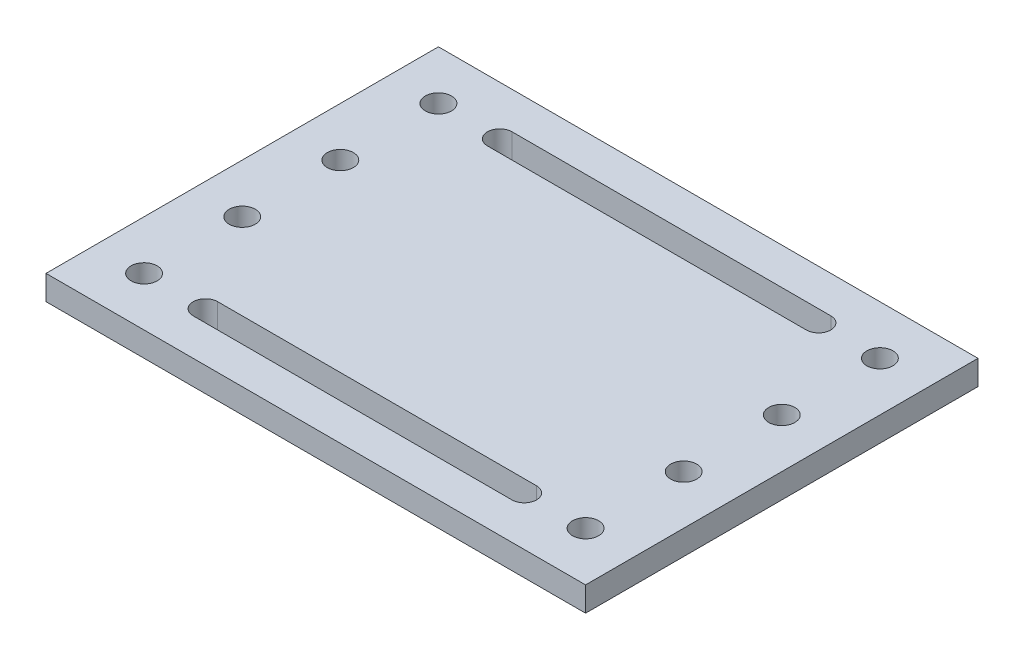
ISO-10303-21;
HEADER;
FILE_DESCRIPTION(('STEP AP214'),'2;1');
FILE_NAME('part.step','',(''),(''),'','','');
FILE_SCHEMA(('AUTOMOTIVE_DESIGN { 1 0 10303 214 1 1 1 1 }'));
ENDSEC;
DATA;
#1=APPLICATION_CONTEXT('core data for automotive mechanical design processes');
#2=APPLICATION_PROTOCOL_DEFINITION('international standard','automotive_design',2000,#1);
#3=PRODUCT_CONTEXT('',#1,'mechanical');
#4=PRODUCT('Part','Part','',(#3));
#5=PRODUCT_RELATED_PRODUCT_CATEGORY('part','',(#4));
#6=PRODUCT_DEFINITION_FORMATION('','',#4);
#7=PRODUCT_DEFINITION_CONTEXT('part definition',#1,'design');
#8=PRODUCT_DEFINITION('design','',#6,#7);
#9=PRODUCT_DEFINITION_SHAPE('','',#8);
#10=(LENGTH_UNIT() NAMED_UNIT(*) SI_UNIT(.MILLI.,.METRE.));
#11=(NAMED_UNIT(*) PLANE_ANGLE_UNIT() SI_UNIT($,.RADIAN.));
#12=(NAMED_UNIT(*) SI_UNIT($,.STERADIAN.) SOLID_ANGLE_UNIT());
#13=UNCERTAINTY_MEASURE_WITH_UNIT(LENGTH_MEASURE(1.E-05),#10,'distance_accuracy_value','');
#14=(GEOMETRIC_REPRESENTATION_CONTEXT(3) GLOBAL_UNCERTAINTY_ASSIGNED_CONTEXT((#13)) GLOBAL_UNIT_ASSIGNED_CONTEXT((#10,
#11,#12)) REPRESENTATION_CONTEXT('',''));
#15=CARTESIAN_POINT('',(0.,0.,0.));
#16=DIRECTION('',(0.,0.,1.));
#17=DIRECTION('',(1.,0.,0.));
#18=AXIS2_PLACEMENT_3D('',#15,#16,#17);
#19=CARTESIAN_POINT('',(0.,0.,0.));
#20=DIRECTION('',(0.,-1.,0.));
#21=DIRECTION('',(0.,0.,-1.));
#22=AXIS2_PLACEMENT_3D('',#19,#20,#21);
#23=PLANE('',#22);
#24=CARTESIAN_POINT('',(215.9,0.,-12.7));
#25=DIRECTION('',(0.,1.,0.));
#26=DIRECTION('',(0.,0.,1.));
#27=AXIS2_PLACEMENT_3D('',#24,#25,#26);
#28=CIRCLE('',#27,3.3782);
#29=CARTESIAN_POINT('',(215.9,0.,-9.3218));
#30=VERTEX_POINT('',#29);
#31=EDGE_CURVE('E240',#30,#30,#28,.T.);
#32=ORIENTED_EDGE('',*,*,#31,.T.);
#33=EDGE_LOOP('',(#32));
#34=FACE_BOUND('',#33,.T.);
#35=CARTESIAN_POINT('',(215.9,0.,-38.1));
#36=DIRECTION('',(0.,1.,0.));
#37=DIRECTION('',(0.,0.,1.));
#38=AXIS2_PLACEMENT_3D('',#35,#36,#37);
#39=CIRCLE('',#38,3.3782);
#40=CARTESIAN_POINT('',(215.9,0.,-34.7218));
#41=VERTEX_POINT('',#40);
#42=EDGE_CURVE('E234',#41,#41,#39,.T.);
#43=ORIENTED_EDGE('',*,*,#42,.T.);
#44=EDGE_LOOP('',(#43));
#45=FACE_BOUND('',#44,.T.);
#46=CARTESIAN_POINT('',(215.9,0.,12.7));
#47=DIRECTION('',(0.,1.,0.));
#48=DIRECTION('',(0.,0.,1.));
#49=AXIS2_PLACEMENT_3D('',#46,#47,#48);
#50=CIRCLE('',#49,3.3782);
#51=CARTESIAN_POINT('',(215.9,0.,16.0782));
#52=VERTEX_POINT('',#51);
#53=EDGE_CURVE('E228',#52,#52,#50,.T.);
#54=ORIENTED_EDGE('',*,*,#53,.T.);
#55=EDGE_LOOP('',(#54));
#56=FACE_BOUND('',#55,.T.);
#57=CARTESIAN_POINT('',(215.9,0.,38.1));
#58=DIRECTION('',(0.,1.,0.));
#59=DIRECTION('',(0.,0.,1.));
#60=AXIS2_PLACEMENT_3D('',#57,#58,#59);
#61=CIRCLE('',#60,3.3782);
#62=CARTESIAN_POINT('',(215.9,0.,41.4782));
#63=VERTEX_POINT('',#62);
#64=EDGE_CURVE('E215',#63,#63,#61,.T.);
#65=ORIENTED_EDGE('',*,*,#64,.T.);
#66=EDGE_LOOP('',(#65));
#67=FACE_BOUND('',#66,.T.);
#68=DIRECTION('',(-1.,0.,0.));
#69=VECTOR('',#68,1.);
#70=CARTESIAN_POINT('',(200.025,0.,-34.925));
#71=LINE('',#70,#69);
#72=CARTESIAN_POINT('',(200.025,0.,-34.925));
#73=VERTEX_POINT('',#72);
#74=CARTESIAN_POINT('',(117.475,0.,-34.925));
#75=VERTEX_POINT('',#74);
#76=EDGE_CURVE('E199',#73,#75,#71,.T.);
#77=ORIENTED_EDGE('',*,*,#76,.F.);
#78=CARTESIAN_POINT('',(200.025,0.,-38.1));
#79=DIRECTION('',(0.,-1.,0.));
#80=DIRECTION('',(0.,0.,-1.));
#81=AXIS2_PLACEMENT_3D('',#78,#79,#80);
#82=CIRCLE('',#81,3.175);
#83=CARTESIAN_POINT('',(200.025,0.,-41.275));
#84=VERTEX_POINT('',#83);
#85=EDGE_CURVE('E207',#84,#73,#82,.T.);
#86=ORIENTED_EDGE('',*,*,#85,.F.);
#87=DIRECTION('',(1.,0.,0.));
#88=VECTOR('',#87,1.);
#89=CARTESIAN_POINT('',(200.025,0.,-41.275));
#90=LINE('',#89,#88);
#91=CARTESIAN_POINT('',(117.475,0.,-41.275));
#92=VERTEX_POINT('',#91);
#93=EDGE_CURVE('E220',#92,#84,#90,.T.);
#94=ORIENTED_EDGE('',*,*,#93,.F.);
#95=CARTESIAN_POINT('',(117.475,0.,-38.1));
#96=DIRECTION('',(0.,-1.,0.));
#97=DIRECTION('',(0.,0.,-1.));
#98=AXIS2_PLACEMENT_3D('',#95,#96,#97);
#99=CIRCLE('',#98,3.175);
#100=EDGE_CURVE('E217',#75,#92,#99,.T.);
#101=ORIENTED_EDGE('',*,*,#100,.F.);
#102=EDGE_LOOP('',(#77,#86,#94,#101));
#103=FACE_BOUND('',#102,.T.);
#104=CARTESIAN_POINT('',(200.025,0.,38.1));
#105=DIRECTION('',(0.,1.,0.));
#106=DIRECTION('',(0.,0.,1.));
#107=AXIS2_PLACEMENT_3D('',#104,#105,#106);
#108=CIRCLE('',#107,3.175);
#109=CARTESIAN_POINT('',(200.025,0.,41.275));
#110=VERTEX_POINT('',#109);
#111=CARTESIAN_POINT('',(200.025,0.,34.925));
#112=VERTEX_POINT('',#111);
#113=EDGE_CURVE('E176',#110,#112,#108,.T.);
#114=ORIENTED_EDGE('',*,*,#113,.T.);
#115=DIRECTION('',(-1.,0.,0.));
#116=VECTOR('',#115,1.);
#117=CARTESIAN_POINT('',(200.025,0.,34.925));
#118=LINE('',#117,#116);
#119=CARTESIAN_POINT('',(117.475,0.,34.925));
#120=VERTEX_POINT('',#119);
#121=EDGE_CURVE('E191',#112,#120,#118,.T.);
#122=ORIENTED_EDGE('',*,*,#121,.T.);
#123=CARTESIAN_POINT('',(117.475,0.,38.1));
#124=DIRECTION('',(0.,1.,0.));
#125=DIRECTION('',(0.,0.,1.));
#126=AXIS2_PLACEMENT_3D('',#123,#124,#125);
#127=CIRCLE('',#126,3.175);
#128=CARTESIAN_POINT('',(117.475,0.,41.275));
#129=VERTEX_POINT('',#128);
#130=EDGE_CURVE('E188',#120,#129,#127,.T.);
#131=ORIENTED_EDGE('',*,*,#130,.T.);
#132=DIRECTION('',(1.,0.,0.));
#133=VECTOR('',#132,1.);
#134=CARTESIAN_POINT('',(200.025,0.,41.275));
#135=LINE('',#134,#133);
#136=EDGE_CURVE('E168',#129,#110,#135,.T.);
#137=ORIENTED_EDGE('',*,*,#136,.T.);
#138=EDGE_LOOP('',(#114,#122,#131,#137));
#139=FACE_BOUND('',#138,.T.);
#140=DIRECTION('',(0.,0.,-1.));
#141=VECTOR('',#140,1.);
#142=CARTESIAN_POINT('',(88.8999999999999,0.,50.8));
#143=LINE('',#142,#141);
#144=CARTESIAN_POINT('',(88.9,0.,50.8));
#145=VERTEX_POINT('',#144);
#146=CARTESIAN_POINT('',(88.8999999999999,0.,-50.8));
#147=VERTEX_POINT('',#146);
#148=EDGE_CURVE('E51',#145,#147,#143,.T.);
#149=ORIENTED_EDGE('',*,*,#148,.T.);
#150=DIRECTION('',(-1.,0.,0.));
#151=VECTOR('',#150,1.);
#152=CARTESIAN_POINT('',(-228.6,0.,-50.8));
#153=LINE('',#152,#151);
#154=CARTESIAN_POINT('',(228.6,0.,-50.8));
#155=VERTEX_POINT('',#154);
#156=EDGE_CURVE('E139',#155,#147,#153,.T.);
#157=ORIENTED_EDGE('',*,*,#156,.F.);
#158=DIRECTION('',(0.,0.,-1.));
#159=VECTOR('',#158,1.);
#160=CARTESIAN_POINT('',(228.6,0.,50.8));
#161=LINE('',#160,#159);
#162=CARTESIAN_POINT('',(228.6,0.,50.8));
#163=VERTEX_POINT('',#162);
#164=EDGE_CURVE('E145',#163,#155,#161,.T.);
#165=ORIENTED_EDGE('',*,*,#164,.F.);
#166=DIRECTION('',(1.,0.,0.));
#167=VECTOR('',#166,1.);
#168=CARTESIAN_POINT('',(-228.6,0.,50.8));
#169=LINE('',#168,#167);
#170=EDGE_CURVE('E140',#145,#163,#169,.T.);
#171=ORIENTED_EDGE('',*,*,#170,.F.);
#172=EDGE_LOOP('',(#149,#157,#165,#171));
#173=FACE_BOUND('',#172,.T.);
#174=CARTESIAN_POINT('',(101.6,0.,-12.7));
#175=DIRECTION('',(0.,1.,0.));
#176=DIRECTION('',(0.,0.,1.));
#177=AXIS2_PLACEMENT_3D('',#174,#175,#176);
#178=CIRCLE('',#177,3.3782);
#179=CARTESIAN_POINT('',(101.6,0.,-9.3218));
#180=VERTEX_POINT('',#179);
#181=EDGE_CURVE('E246',#180,#180,#178,.T.);
#182=ORIENTED_EDGE('',*,*,#181,.T.);
#183=EDGE_LOOP('',(#182));
#184=FACE_BOUND('',#183,.T.);
#185=CARTESIAN_POINT('',(101.6,0.,-38.1));
#186=DIRECTION('',(0.,1.,0.));
#187=DIRECTION('',(0.,0.,1.));
#188=AXIS2_PLACEMENT_3D('',#185,#186,#187);
#189=CIRCLE('',#188,3.3782);
#190=CARTESIAN_POINT('',(101.6,0.,-34.7218));
#191=VERTEX_POINT('',#190);
#192=EDGE_CURVE('E253',#191,#191,#189,.T.);
#193=ORIENTED_EDGE('',*,*,#192,.T.);
#194=EDGE_LOOP('',(#193));
#195=FACE_BOUND('',#194,.T.);
#196=CARTESIAN_POINT('',(101.6,0.,12.7));
#197=DIRECTION('',(0.,1.,0.));
#198=DIRECTION('',(0.,0.,1.));
#199=AXIS2_PLACEMENT_3D('',#196,#197,#198);
#200=CIRCLE('',#199,3.3782);
#201=CARTESIAN_POINT('',(101.6,0.,16.0782));
#202=VERTEX_POINT('',#201);
#203=EDGE_CURVE('E259',#202,#202,#200,.T.);
#204=ORIENTED_EDGE('',*,*,#203,.T.);
#205=EDGE_LOOP('',(#204));
#206=FACE_BOUND('',#205,.T.);
#207=CARTESIAN_POINT('',(101.6,0.,38.1));
#208=DIRECTION('',(0.,1.,0.));
#209=DIRECTION('',(0.,0.,1.));
#210=AXIS2_PLACEMENT_3D('',#207,#208,#209);
#211=CIRCLE('',#210,3.3782);
#212=CARTESIAN_POINT('',(101.6,0.,41.4782));
#213=VERTEX_POINT('',#212);
#214=EDGE_CURVE('E265',#213,#213,#211,.T.);
#215=ORIENTED_EDGE('',*,*,#214,.T.);
#216=EDGE_LOOP('',(#215));
#217=FACE_BOUND('',#216,.T.);
#218=ADVANCED_FACE('F36',(#34,#45,#56,#67,#103,#139,#173,#184,#195,#206,#217),#23,.T.);
#219=CARTESIAN_POINT('',(0.,6.35,0.));
#220=DIRECTION('',(0.,-1.,0.));
#221=DIRECTION('',(0.,0.,-1.));
#222=AXIS2_PLACEMENT_3D('',#219,#220,#221);
#223=PLANE('',#222);
#224=CARTESIAN_POINT('',(101.6,6.35,38.1));
#225=DIRECTION('',(0.,1.,0.));
#226=DIRECTION('',(0.,0.,1.));
#227=AXIS2_PLACEMENT_3D('',#224,#225,#226);
#228=CIRCLE('',#227,3.37819999999998);
#229=CARTESIAN_POINT('',(101.6,6.35,41.4782));
#230=VERTEX_POINT('',#229);
#231=EDGE_CURVE('E268',#230,#230,#228,.T.);
#232=ORIENTED_EDGE('',*,*,#231,.F.);
#233=EDGE_LOOP('',(#232));
#234=FACE_BOUND('',#233,.T.);
#235=CARTESIAN_POINT('',(101.6,6.35,12.7));
#236=DIRECTION('',(0.,1.,0.));
#237=DIRECTION('',(0.,0.,1.));
#238=AXIS2_PLACEMENT_3D('',#235,#236,#237);
#239=CIRCLE('',#238,3.37819999999998);
#240=CARTESIAN_POINT('',(101.6,6.35,16.0782));
#241=VERTEX_POINT('',#240);
#242=EDGE_CURVE('E262',#241,#241,#239,.T.);
#243=ORIENTED_EDGE('',*,*,#242,.F.);
#244=EDGE_LOOP('',(#243));
#245=FACE_BOUND('',#244,.T.);
#246=CARTESIAN_POINT('',(101.6,6.35,-12.7));
#247=DIRECTION('',(0.,1.,0.));
#248=DIRECTION('',(0.,0.,1.));
#249=AXIS2_PLACEMENT_3D('',#246,#247,#248);
#250=CIRCLE('',#249,3.37819999999998);
#251=CARTESIAN_POINT('',(101.6,6.35,-9.32180000000001));
#252=VERTEX_POINT('',#251);
#253=EDGE_CURVE('E250',#252,#252,#250,.T.);
#254=ORIENTED_EDGE('',*,*,#253,.F.);
#255=EDGE_LOOP('',(#254));
#256=FACE_BOUND('',#255,.T.);
#257=CARTESIAN_POINT('',(215.9,6.35,12.7));
#258=DIRECTION('',(0.,1.,0.));
#259=DIRECTION('',(0.,0.,1.));
#260=AXIS2_PLACEMENT_3D('',#257,#258,#259);
#261=CIRCLE('',#260,3.3782);
#262=CARTESIAN_POINT('',(215.9,6.35,16.0782));
#263=VERTEX_POINT('',#262);
#264=EDGE_CURVE('E231',#263,#263,#261,.T.);
#265=ORIENTED_EDGE('',*,*,#264,.F.);
#266=EDGE_LOOP('',(#265));
#267=FACE_BOUND('',#266,.T.);
#268=CARTESIAN_POINT('',(200.025,6.35,-38.1));
#269=DIRECTION('',(0.,-1.,0.));
#270=DIRECTION('',(0.,0.,-1.));
#271=AXIS2_PLACEMENT_3D('',#268,#269,#270);
#272=CIRCLE('',#271,3.175);
#273=CARTESIAN_POINT('',(200.025,6.35,-41.275));
#274=VERTEX_POINT('',#273);
#275=CARTESIAN_POINT('',(200.025,6.35,-34.925));
#276=VERTEX_POINT('',#275);
#277=EDGE_CURVE('E59',#274,#276,#272,.T.);
#278=ORIENTED_EDGE('',*,*,#277,.T.);
#279=DIRECTION('',(-1.,0.,0.));
#280=VECTOR('',#279,1.);
#281=CARTESIAN_POINT('',(200.025,6.35,-34.925));
#282=LINE('',#281,#280);
#283=CARTESIAN_POINT('',(117.475,6.35,-34.925));
#284=VERTEX_POINT('',#283);
#285=EDGE_CURVE('E204',#276,#284,#282,.T.);
#286=ORIENTED_EDGE('',*,*,#285,.T.);
#287=CARTESIAN_POINT('',(117.475,6.35,-38.1));
#288=DIRECTION('',(0.,-1.,0.));
#289=DIRECTION('',(0.,0.,-1.));
#290=AXIS2_PLACEMENT_3D('',#287,#288,#289);
#291=CIRCLE('',#290,3.175);
#292=CARTESIAN_POINT('',(117.475,6.35,-41.275));
#293=VERTEX_POINT('',#292);
#294=EDGE_CURVE('E208',#284,#293,#291,.T.);
#295=ORIENTED_EDGE('',*,*,#294,.T.);
#296=DIRECTION('',(1.,0.,0.));
#297=VECTOR('',#296,1.);
#298=CARTESIAN_POINT('',(200.025,6.35,-41.275));
#299=LINE('',#298,#297);
#300=EDGE_CURVE('E211',#293,#274,#299,.T.);
#301=ORIENTED_EDGE('',*,*,#300,.T.);
#302=EDGE_LOOP('',(#278,#286,#295,#301));
#303=FACE_BOUND('',#302,.T.);
#304=DIRECTION('',(-1.,0.,0.));
#305=VECTOR('',#304,1.);
#306=CARTESIAN_POINT('',(200.025,6.35,34.925));
#307=LINE('',#306,#305);
#308=CARTESIAN_POINT('',(200.025,6.35,34.925));
#309=VERTEX_POINT('',#308);
#310=CARTESIAN_POINT('',(117.475,6.35,34.925));
#311=VERTEX_POINT('',#310);
#312=EDGE_CURVE('E180',#309,#311,#307,.T.);
#313=ORIENTED_EDGE('',*,*,#312,.F.);
#314=CARTESIAN_POINT('',(200.025,6.35,38.1));
#315=DIRECTION('',(0.,1.,0.));
#316=DIRECTION('',(0.,0.,1.));
#317=AXIS2_PLACEMENT_3D('',#314,#315,#316);
#318=CIRCLE('',#317,3.175);
#319=CARTESIAN_POINT('',(200.025,6.35,41.275));
#320=VERTEX_POINT('',#319);
#321=EDGE_CURVE('E183',#320,#309,#318,.T.);
#322=ORIENTED_EDGE('',*,*,#321,.F.);
#323=DIRECTION('',(1.,0.,0.));
#324=VECTOR('',#323,1.);
#325=CARTESIAN_POINT('',(200.025,6.35,41.275));
#326=LINE('',#325,#324);
#327=CARTESIAN_POINT('',(117.475,6.35,41.275));
#328=VERTEX_POINT('',#327);
#329=EDGE_CURVE('E173',#328,#320,#326,.T.);
#330=ORIENTED_EDGE('',*,*,#329,.F.);
#331=CARTESIAN_POINT('',(117.475,6.35,38.1));
#332=DIRECTION('',(0.,1.,0.));
#333=DIRECTION('',(0.,0.,1.));
#334=AXIS2_PLACEMENT_3D('',#331,#332,#333);
#335=CIRCLE('',#334,3.175);
#336=EDGE_CURVE('E177',#311,#328,#335,.T.);
#337=ORIENTED_EDGE('',*,*,#336,.F.);
#338=EDGE_LOOP('',(#313,#322,#330,#337));
#339=FACE_BOUND('',#338,.T.);
#340=DIRECTION('',(-1.,0.,0.));
#341=VECTOR('',#340,1.);
#342=CARTESIAN_POINT('',(-228.6,6.35,-50.8));
#343=LINE('',#342,#341);
#344=CARTESIAN_POINT('',(228.6,6.35,-50.8));
#345=VERTEX_POINT('',#344);
#346=CARTESIAN_POINT('',(88.8999999999999,6.35,-50.8));
#347=VERTEX_POINT('',#346);
#348=EDGE_CURVE('E157',#345,#347,#343,.T.);
#349=ORIENTED_EDGE('',*,*,#348,.T.);
#350=DIRECTION('',(0.,0.,-1.));
#351=VECTOR('',#350,1.);
#352=CARTESIAN_POINT('',(88.8999999999999,6.35,50.8));
#353=LINE('',#352,#351);
#354=CARTESIAN_POINT('',(88.8999999999999,6.35,50.8));
#355=VERTEX_POINT('',#354);
#356=EDGE_CURVE('E128',#355,#347,#353,.T.);
#357=ORIENTED_EDGE('',*,*,#356,.F.);
#358=DIRECTION('',(1.,0.,0.));
#359=VECTOR('',#358,1.);
#360=CARTESIAN_POINT('',(-228.6,6.35,50.8));
#361=LINE('',#360,#359);
#362=CARTESIAN_POINT('',(228.6,6.35,50.8));
#363=VERTEX_POINT('',#362);
#364=EDGE_CURVE('E153',#355,#363,#361,.T.);
#365=ORIENTED_EDGE('',*,*,#364,.T.);
#366=DIRECTION('',(0.,0.,-1.));
#367=VECTOR('',#366,1.);
#368=CARTESIAN_POINT('',(228.6,6.35,50.8));
#369=LINE('',#368,#367);
#370=EDGE_CURVE('E147',#363,#345,#369,.T.);
#371=ORIENTED_EDGE('',*,*,#370,.T.);
#372=EDGE_LOOP('',(#349,#357,#365,#371));
#373=FACE_BOUND('',#372,.T.);
#374=CARTESIAN_POINT('',(215.9,6.35,38.1));
#375=DIRECTION('',(0.,1.,0.));
#376=DIRECTION('',(0.,0.,1.));
#377=AXIS2_PLACEMENT_3D('',#374,#375,#376);
#378=CIRCLE('',#377,3.3782);
#379=CARTESIAN_POINT('',(215.9,6.35,41.4782));
#380=VERTEX_POINT('',#379);
#381=EDGE_CURVE('E225',#380,#380,#378,.T.);
#382=ORIENTED_EDGE('',*,*,#381,.F.);
#383=EDGE_LOOP('',(#382));
#384=FACE_BOUND('',#383,.T.);
#385=CARTESIAN_POINT('',(215.9,6.35,-38.1));
#386=DIRECTION('',(0.,1.,0.));
#387=DIRECTION('',(0.,0.,1.));
#388=AXIS2_PLACEMENT_3D('',#385,#386,#387);
#389=CIRCLE('',#388,3.3782);
#390=CARTESIAN_POINT('',(215.9,6.35,-34.7218));
#391=VERTEX_POINT('',#390);
#392=EDGE_CURVE('E237',#391,#391,#389,.T.);
#393=ORIENTED_EDGE('',*,*,#392,.F.);
#394=EDGE_LOOP('',(#393));
#395=FACE_BOUND('',#394,.T.);
#396=CARTESIAN_POINT('',(215.9,6.35,-12.7));
#397=DIRECTION('',(0.,1.,0.));
#398=DIRECTION('',(0.,0.,1.));
#399=AXIS2_PLACEMENT_3D('',#396,#397,#398);
#400=CIRCLE('',#399,3.3782);
#401=CARTESIAN_POINT('',(215.9,6.35,-9.3218));
#402=VERTEX_POINT('',#401);
#403=EDGE_CURVE('E132',#402,#402,#400,.T.);
#404=ORIENTED_EDGE('',*,*,#403,.F.);
#405=EDGE_LOOP('',(#404));
#406=FACE_BOUND('',#405,.T.);
#407=CARTESIAN_POINT('',(101.6,6.35,-38.1));
#408=DIRECTION('',(0.,1.,0.));
#409=DIRECTION('',(0.,0.,1.));
#410=AXIS2_PLACEMENT_3D('',#407,#408,#409);
#411=CIRCLE('',#410,3.37819999999998);
#412=CARTESIAN_POINT('',(101.6,6.35,-34.7218));
#413=VERTEX_POINT('',#412);
#414=EDGE_CURVE('E256',#413,#413,#411,.T.);
#415=ORIENTED_EDGE('',*,*,#414,.F.);
#416=EDGE_LOOP('',(#415));
#417=FACE_BOUND('',#416,.T.);
#418=ADVANCED_FACE('F274',(#234,#245,#256,#267,#303,#339,#373,#384,#395,#406,#417),#223,.F.);
#419=CARTESIAN_POINT('',(228.6,6.35,50.8));
#420=DIRECTION('',(-1.,0.,0.));
#421=DIRECTION('',(0.,0.,1.));
#422=AXIS2_PLACEMENT_3D('',#419,#420,#421);
#423=PLANE('',#422);
#424=ORIENTED_EDGE('',*,*,#164,.T.);
#425=DIRECTION('',(0.,-1.,0.));
#426=VECTOR('',#425,1.);
#427=CARTESIAN_POINT('',(228.6,6.35,-50.8));
#428=LINE('',#427,#426);
#429=EDGE_CURVE('E11',#345,#155,#428,.T.);
#430=ORIENTED_EDGE('',*,*,#429,.F.);
#431=ORIENTED_EDGE('',*,*,#370,.F.);
#432=DIRECTION('',(0.,-1.,0.));
#433=VECTOR('',#432,1.);
#434=CARTESIAN_POINT('',(228.6,6.35,50.8));
#435=LINE('',#434,#433);
#436=EDGE_CURVE('E44',#363,#163,#435,.T.);
#437=ORIENTED_EDGE('',*,*,#436,.T.);
#438=EDGE_LOOP('',(#424,#430,#431,#437));
#439=FACE_BOUND('',#438,.T.);
#440=ADVANCED_FACE('F38',(#439),#423,.F.);
#441=CARTESIAN_POINT('',(-228.6,6.35,-50.8));
#442=DIRECTION('',(0.,0.,1.));
#443=DIRECTION('',(1.,0.,0.));
#444=AXIS2_PLACEMENT_3D('',#441,#442,#443);
#445=PLANE('',#444);
#446=ORIENTED_EDGE('',*,*,#156,.T.);
#447=DIRECTION('',(0.,1.,0.));
#448=VECTOR('',#447,1.);
#449=CARTESIAN_POINT('',(88.8999999999999,0.,-50.8));
#450=LINE('',#449,#448);
#451=EDGE_CURVE('E125',#147,#347,#450,.T.);
#452=ORIENTED_EDGE('',*,*,#451,.T.);
#453=ORIENTED_EDGE('',*,*,#348,.F.);
#454=ORIENTED_EDGE('',*,*,#429,.T.);
#455=EDGE_LOOP('',(#446,#452,#453,#454));
#456=FACE_BOUND('',#455,.T.);
#457=ADVANCED_FACE('F142',(#456),#445,.F.);
#458=CARTESIAN_POINT('',(-228.6,6.35,50.8));
#459=DIRECTION('',(0.,0.,-1.));
#460=DIRECTION('',(-1.,0.,0.));
#461=AXIS2_PLACEMENT_3D('',#458,#459,#460);
#462=PLANE('',#461);
#463=ORIENTED_EDGE('',*,*,#364,.F.);
#464=DIRECTION('',(0.,1.,0.));
#465=VECTOR('',#464,1.);
#466=CARTESIAN_POINT('',(88.8999999999999,0.,50.8));
#467=LINE('',#466,#465);
#468=EDGE_CURVE('E133',#145,#355,#467,.T.);
#469=ORIENTED_EDGE('',*,*,#468,.F.);
#470=ORIENTED_EDGE('',*,*,#170,.T.);
#471=ORIENTED_EDGE('',*,*,#436,.F.);
#472=EDGE_LOOP('',(#463,#469,#470,#471));
#473=FACE_BOUND('',#472,.T.);
#474=ADVANCED_FACE('F320',(#473),#462,.F.);
#475=CARTESIAN_POINT('',(200.025,0.,38.1));
#476=DIRECTION('',(0.,1.,0.));
#477=DIRECTION('',(0.,0.,1.));
#478=AXIS2_PLACEMENT_3D('',#475,#476,#477);
#479=CYLINDRICAL_SURFACE('',#478,3.175);
#480=ORIENTED_EDGE('',*,*,#321,.T.);
#481=DIRECTION('',(0.,1.,0.));
#482=VECTOR('',#481,1.);
#483=CARTESIAN_POINT('',(200.025,0.,34.925));
#484=LINE('',#483,#482);
#485=EDGE_CURVE('E164',#112,#309,#484,.T.);
#486=ORIENTED_EDGE('',*,*,#485,.F.);
#487=ORIENTED_EDGE('',*,*,#113,.F.);
#488=DIRECTION('',(0.,1.,0.));
#489=VECTOR('',#488,1.);
#490=CARTESIAN_POINT('',(200.025,0.,41.275));
#491=LINE('',#490,#489);
#492=EDGE_CURVE('E149',#110,#320,#491,.T.);
#493=ORIENTED_EDGE('',*,*,#492,.T.);
#494=EDGE_LOOP('',(#480,#486,#487,#493));
#495=FACE_BOUND('',#494,.T.);
#496=ADVANCED_FACE('F322',(#495),#479,.F.);
#497=CARTESIAN_POINT('',(200.025,0.,41.275));
#498=DIRECTION('',(0.,0.,1.));
#499=DIRECTION('',(1.,0.,0.));
#500=AXIS2_PLACEMENT_3D('',#497,#498,#499);
#501=PLANE('',#500);
#502=ORIENTED_EDGE('',*,*,#329,.T.);
#503=ORIENTED_EDGE('',*,*,#492,.F.);
#504=ORIENTED_EDGE('',*,*,#136,.F.);
#505=DIRECTION('',(0.,1.,0.));
#506=VECTOR('',#505,1.);
#507=CARTESIAN_POINT('',(117.475,0.,41.275));
#508=LINE('',#507,#506);
#509=EDGE_CURVE('E170',#129,#328,#508,.T.);
#510=ORIENTED_EDGE('',*,*,#509,.T.);
#511=EDGE_LOOP('',(#502,#503,#504,#510));
#512=FACE_BOUND('',#511,.T.);
#513=ADVANCED_FACE('F486',(#512),#501,.F.);
#514=CARTESIAN_POINT('',(117.475,0.,38.1));
#515=DIRECTION('',(0.,1.,0.));
#516=DIRECTION('',(0.,0.,1.));
#517=AXIS2_PLACEMENT_3D('',#514,#515,#516);
#518=CYLINDRICAL_SURFACE('',#517,3.175);
#519=ORIENTED_EDGE('',*,*,#336,.T.);
#520=ORIENTED_EDGE('',*,*,#509,.F.);
#521=ORIENTED_EDGE('',*,*,#130,.F.);
#522=DIRECTION('',(0.,1.,0.));
#523=VECTOR('',#522,1.);
#524=CARTESIAN_POINT('',(117.475,0.,34.925));
#525=LINE('',#524,#523);
#526=EDGE_CURVE('E167',#120,#311,#525,.T.);
#527=ORIENTED_EDGE('',*,*,#526,.T.);
#528=EDGE_LOOP('',(#519,#520,#521,#527));
#529=FACE_BOUND('',#528,.T.);
#530=ADVANCED_FACE('F476',(#529),#518,.F.);
#531=CARTESIAN_POINT('',(200.025,0.,34.925));
#532=DIRECTION('',(0.,0.,-1.));
#533=DIRECTION('',(-1.,0.,0.));
#534=AXIS2_PLACEMENT_3D('',#531,#532,#533);
#535=PLANE('',#534);
#536=ORIENTED_EDGE('',*,*,#312,.T.);
#537=ORIENTED_EDGE('',*,*,#526,.F.);
#538=ORIENTED_EDGE('',*,*,#121,.F.);
#539=ORIENTED_EDGE('',*,*,#485,.T.);
#540=EDGE_LOOP('',(#536,#537,#538,#539));
#541=FACE_BOUND('',#540,.T.);
#542=ADVANCED_FACE('F467',(#541),#535,.F.);
#543=CARTESIAN_POINT('',(200.025,0.,-38.1));
#544=DIRECTION('',(0.,1.,0.));
#545=DIRECTION('',(0.,0.,1.));
#546=AXIS2_PLACEMENT_3D('',#543,#544,#545);
#547=CYLINDRICAL_SURFACE('',#546,3.175);
#548=ORIENTED_EDGE('',*,*,#277,.F.);
#549=DIRECTION('',(0.,1.,0.));
#550=VECTOR('',#549,1.);
#551=CARTESIAN_POINT('',(200.025,0.,-41.275));
#552=LINE('',#551,#550);
#553=EDGE_CURVE('E196',#84,#274,#552,.T.);
#554=ORIENTED_EDGE('',*,*,#553,.F.);
#555=ORIENTED_EDGE('',*,*,#85,.T.);
#556=DIRECTION('',(0.,1.,0.));
#557=VECTOR('',#556,1.);
#558=CARTESIAN_POINT('',(200.025,0.,-34.925));
#559=LINE('',#558,#557);
#560=EDGE_CURVE('E185',#73,#276,#559,.T.);
#561=ORIENTED_EDGE('',*,*,#560,.T.);
#562=EDGE_LOOP('',(#548,#554,#555,#561));
#563=FACE_BOUND('',#562,.T.);
#564=ADVANCED_FACE('F457',(#563),#547,.F.);
#565=CARTESIAN_POINT('',(200.025,0.,-34.925));
#566=DIRECTION('',(0.,0.,-1.));
#567=DIRECTION('',(-1.,0.,0.));
#568=AXIS2_PLACEMENT_3D('',#565,#566,#567);
#569=PLANE('',#568);
#570=ORIENTED_EDGE('',*,*,#285,.F.);
#571=ORIENTED_EDGE('',*,*,#560,.F.);
#572=ORIENTED_EDGE('',*,*,#76,.T.);
#573=DIRECTION('',(0.,1.,0.));
#574=VECTOR('',#573,1.);
#575=CARTESIAN_POINT('',(117.475,0.,-34.925));
#576=LINE('',#575,#574);
#577=EDGE_CURVE('E201',#75,#284,#576,.T.);
#578=ORIENTED_EDGE('',*,*,#577,.T.);
#579=EDGE_LOOP('',(#570,#571,#572,#578));
#580=FACE_BOUND('',#579,.T.);
#581=ADVANCED_FACE('F447',(#580),#569,.T.);
#582=CARTESIAN_POINT('',(117.475,0.,-38.1));
#583=DIRECTION('',(0.,1.,0.));
#584=DIRECTION('',(0.,0.,1.));
#585=AXIS2_PLACEMENT_3D('',#582,#583,#584);
#586=CYLINDRICAL_SURFACE('',#585,3.175);
#587=ORIENTED_EDGE('',*,*,#294,.F.);
#588=ORIENTED_EDGE('',*,*,#577,.F.);
#589=ORIENTED_EDGE('',*,*,#100,.T.);
#590=DIRECTION('',(0.,1.,0.));
#591=VECTOR('',#590,1.);
#592=CARTESIAN_POINT('',(117.475,0.,-41.275));
#593=LINE('',#592,#591);
#594=EDGE_CURVE('E198',#92,#293,#593,.T.);
#595=ORIENTED_EDGE('',*,*,#594,.T.);
#596=EDGE_LOOP('',(#587,#588,#589,#595));
#597=FACE_BOUND('',#596,.T.);
#598=ADVANCED_FACE('F437',(#597),#586,.F.);
#599=CARTESIAN_POINT('',(200.025,0.,-41.275));
#600=DIRECTION('',(0.,0.,1.));
#601=DIRECTION('',(1.,0.,0.));
#602=AXIS2_PLACEMENT_3D('',#599,#600,#601);
#603=PLANE('',#602);
#604=ORIENTED_EDGE('',*,*,#300,.F.);
#605=ORIENTED_EDGE('',*,*,#594,.F.);
#606=ORIENTED_EDGE('',*,*,#93,.T.);
#607=ORIENTED_EDGE('',*,*,#553,.T.);
#608=EDGE_LOOP('',(#604,#605,#606,#607));
#609=FACE_BOUND('',#608,.T.);
#610=ADVANCED_FACE('F427',(#609),#603,.T.);
#611=CARTESIAN_POINT('',(215.9,6.35,38.1));
#612=DIRECTION('',(0.,1.,0.));
#613=DIRECTION('',(0.,0.,1.));
#614=AXIS2_PLACEMENT_3D('',#611,#612,#613);
#615=CYLINDRICAL_SURFACE('',#614,3.3782);
#616=ORIENTED_EDGE('',*,*,#64,.F.);
#617=EDGE_LOOP('',(#616));
#618=FACE_BOUND('',#617,.T.);
#619=ORIENTED_EDGE('',*,*,#381,.T.);
#620=EDGE_LOOP('',(#619));
#621=FACE_BOUND('',#620,.T.);
#622=ADVANCED_FACE('F417',(#618,#621),#615,.F.);
#623=CARTESIAN_POINT('',(215.9,6.35,12.7));
#624=DIRECTION('',(0.,1.,0.));
#625=DIRECTION('',(0.,0.,1.));
#626=AXIS2_PLACEMENT_3D('',#623,#624,#625);
#627=CYLINDRICAL_SURFACE('',#626,3.3782);
#628=ORIENTED_EDGE('',*,*,#53,.F.);
#629=EDGE_LOOP('',(#628));
#630=FACE_BOUND('',#629,.T.);
#631=ORIENTED_EDGE('',*,*,#264,.T.);
#632=EDGE_LOOP('',(#631));
#633=FACE_BOUND('',#632,.T.);
#634=ADVANCED_FACE('F407',(#630,#633),#627,.F.);
#635=CARTESIAN_POINT('',(215.9,6.35,-38.1));
#636=DIRECTION('',(0.,1.,0.));
#637=DIRECTION('',(0.,0.,1.));
#638=AXIS2_PLACEMENT_3D('',#635,#636,#637);
#639=CYLINDRICAL_SURFACE('',#638,3.3782);
#640=ORIENTED_EDGE('',*,*,#42,.F.);
#641=EDGE_LOOP('',(#640));
#642=FACE_BOUND('',#641,.T.);
#643=ORIENTED_EDGE('',*,*,#392,.T.);
#644=EDGE_LOOP('',(#643));
#645=FACE_BOUND('',#644,.T.);
#646=ADVANCED_FACE('F397',(#642,#645),#639,.F.);
#647=CARTESIAN_POINT('',(215.9,6.35,-12.7));
#648=DIRECTION('',(0.,1.,0.));
#649=DIRECTION('',(0.,0.,1.));
#650=AXIS2_PLACEMENT_3D('',#647,#648,#649);
#651=CYLINDRICAL_SURFACE('',#650,3.3782);
#652=ORIENTED_EDGE('',*,*,#31,.F.);
#653=EDGE_LOOP('',(#652));
#654=FACE_BOUND('',#653,.T.);
#655=ORIENTED_EDGE('',*,*,#403,.T.);
#656=EDGE_LOOP('',(#655));
#657=FACE_BOUND('',#656,.T.);
#658=ADVANCED_FACE('F376',(#654,#657),#651,.F.);
#659=CARTESIAN_POINT('',(88.8999999999999,0.,50.8));
#660=DIRECTION('',(1.,0.,0.));
#661=DIRECTION('',(0.,0.,-1.));
#662=AXIS2_PLACEMENT_3D('',#659,#660,#661);
#663=PLANE('',#662);
#664=ORIENTED_EDGE('',*,*,#356,.T.);
#665=ORIENTED_EDGE('',*,*,#451,.F.);
#666=ORIENTED_EDGE('',*,*,#148,.F.);
#667=ORIENTED_EDGE('',*,*,#468,.T.);
#668=EDGE_LOOP('',(#664,#665,#666,#667));
#669=FACE_BOUND('',#668,.T.);
#670=ADVANCED_FACE('F126',(#669),#663,.F.);
#671=CARTESIAN_POINT('',(101.6,6.35,-12.7));
#672=DIRECTION('',(0.,1.,0.));
#673=DIRECTION('',(0.,0.,1.));
#674=AXIS2_PLACEMENT_3D('',#671,#672,#673);
#675=CYLINDRICAL_SURFACE('',#674,3.37819999999999);
#676=ORIENTED_EDGE('',*,*,#181,.F.);
#677=EDGE_LOOP('',(#676));
#678=FACE_BOUND('',#677,.T.);
#679=ORIENTED_EDGE('',*,*,#253,.T.);
#680=EDGE_LOOP('',(#679));
#681=FACE_BOUND('',#680,.T.);
#682=ADVANCED_FACE('F300',(#678,#681),#675,.F.);
#683=CARTESIAN_POINT('',(101.6,6.35,-38.1));
#684=DIRECTION('',(0.,1.,0.));
#685=DIRECTION('',(0.,0.,1.));
#686=AXIS2_PLACEMENT_3D('',#683,#684,#685);
#687=CYLINDRICAL_SURFACE('',#686,3.37819999999999);
#688=ORIENTED_EDGE('',*,*,#192,.F.);
#689=EDGE_LOOP('',(#688));
#690=FACE_BOUND('',#689,.T.);
#691=ORIENTED_EDGE('',*,*,#414,.T.);
#692=EDGE_LOOP('',(#691));
#693=FACE_BOUND('',#692,.T.);
#694=ADVANCED_FACE('F297',(#690,#693),#687,.F.);
#695=CARTESIAN_POINT('',(101.6,6.35,12.7));
#696=DIRECTION('',(0.,1.,0.));
#697=DIRECTION('',(0.,0.,1.));
#698=AXIS2_PLACEMENT_3D('',#695,#696,#697);
#699=CYLINDRICAL_SURFACE('',#698,3.37819999999999);
#700=ORIENTED_EDGE('',*,*,#203,.F.);
#701=EDGE_LOOP('',(#700));
#702=FACE_BOUND('',#701,.T.);
#703=ORIENTED_EDGE('',*,*,#242,.T.);
#704=EDGE_LOOP('',(#703));
#705=FACE_BOUND('',#704,.T.);
#706=ADVANCED_FACE('F299',(#702,#705),#699,.F.);
#707=CARTESIAN_POINT('',(101.6,6.35,38.1));
#708=DIRECTION('',(0.,1.,0.));
#709=DIRECTION('',(0.,0.,1.));
#710=AXIS2_PLACEMENT_3D('',#707,#708,#709);
#711=CYLINDRICAL_SURFACE('',#710,3.37819999999999);
#712=ORIENTED_EDGE('',*,*,#214,.F.);
#713=EDGE_LOOP('',(#712));
#714=FACE_BOUND('',#713,.T.);
#715=ORIENTED_EDGE('',*,*,#231,.T.);
#716=EDGE_LOOP('',(#715));
#717=FACE_BOUND('',#716,.T.);
#718=ADVANCED_FACE('F272',(#714,#717),#711,.F.);
#719=CLOSED_SHELL('',(#218,#418,#440,#457,#474,#496,#513,#530,#542,#564,#581,#598,#610,#622,
#634,#646,#658,#670,#682,#694,#706,#718));
#720=MANIFOLD_SOLID_BREP('B2',#719);
#721=ADVANCED_BREP_SHAPE_REPRESENTATION('',(#18,#720),#14);
#722=SHAPE_DEFINITION_REPRESENTATION(#9,#721);
ENDSEC;
END-ISO-10303-21;
